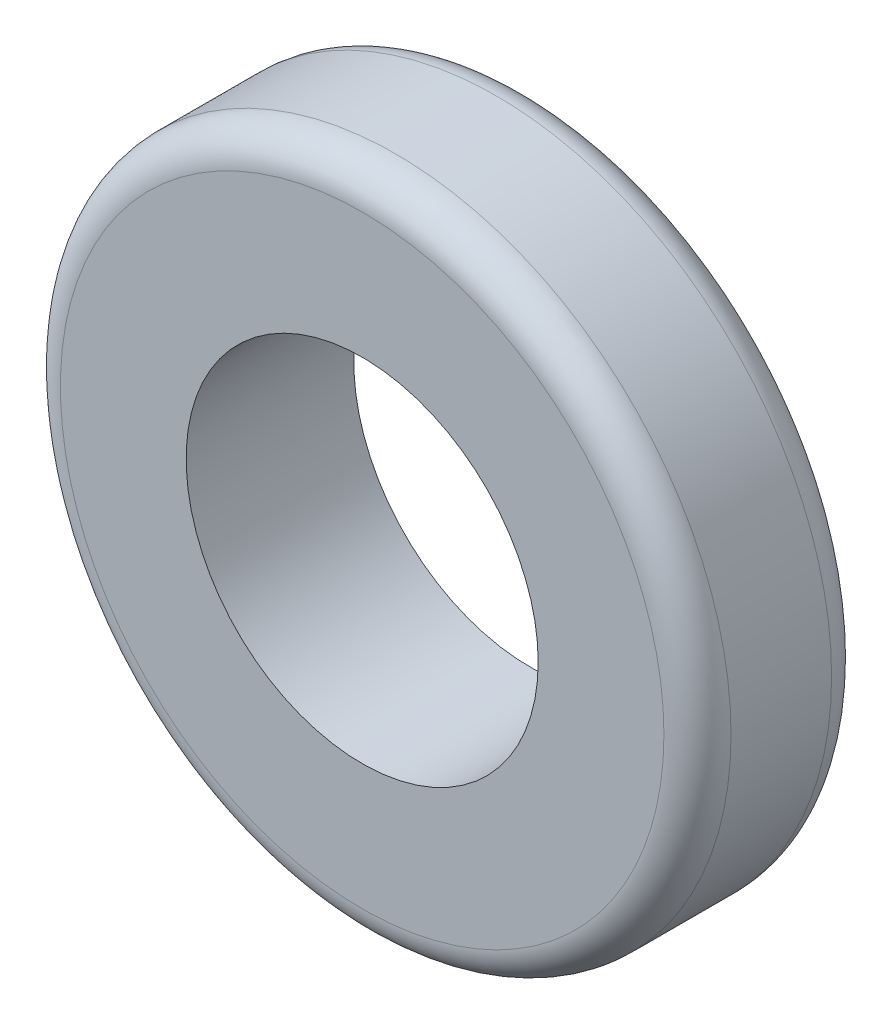
ISO-10303-21;
HEADER;
FILE_DESCRIPTION(('STEP AP214'),'2;1');
FILE_NAME('part.step','',(''),(''),'','','');
FILE_SCHEMA(('AUTOMOTIVE_DESIGN { 1 0 10303 214 1 1 1 1 }'));
ENDSEC;
DATA;
#1=APPLICATION_CONTEXT('core data for automotive mechanical design processes');
#2=APPLICATION_PROTOCOL_DEFINITION('international standard','automotive_design',2000,#1);
#3=PRODUCT_CONTEXT('',#1,'mechanical');
#4=PRODUCT('Part','Part','',(#3));
#5=PRODUCT_RELATED_PRODUCT_CATEGORY('part','',(#4));
#6=PRODUCT_DEFINITION_FORMATION('','',#4);
#7=PRODUCT_DEFINITION_CONTEXT('part definition',#1,'design');
#8=PRODUCT_DEFINITION('design','',#6,#7);
#9=PRODUCT_DEFINITION_SHAPE('','',#8);
#10=(LENGTH_UNIT() NAMED_UNIT(*) SI_UNIT(.MILLI.,.METRE.));
#11=(NAMED_UNIT(*) PLANE_ANGLE_UNIT() SI_UNIT($,.RADIAN.));
#12=(NAMED_UNIT(*) SI_UNIT($,.STERADIAN.) SOLID_ANGLE_UNIT());
#13=UNCERTAINTY_MEASURE_WITH_UNIT(LENGTH_MEASURE(1.E-05),#10,'distance_accuracy_value','');
#14=(GEOMETRIC_REPRESENTATION_CONTEXT(3) GLOBAL_UNCERTAINTY_ASSIGNED_CONTEXT((#13)) GLOBAL_UNIT_ASSIGNED_CONTEXT((#10,
#11,#12)) REPRESENTATION_CONTEXT('',''));
#15=CARTESIAN_POINT('',(0.,0.,0.));
#16=DIRECTION('',(0.,0.,1.));
#17=DIRECTION('',(1.,0.,0.));
#18=AXIS2_PLACEMENT_3D('',#15,#16,#17);
#19=CARTESIAN_POINT('',(0.,0.,6.35));
#20=DIRECTION('',(0.,0.,1.));
#21=DIRECTION('',(1.,0.,0.));
#22=AXIS2_PLACEMENT_3D('',#19,#20,#21);
#23=PLANE('',#22);
#24=CARTESIAN_POINT('',(0.,0.,6.35));
#25=DIRECTION('',(0.,0.,1.));
#26=DIRECTION('',(1.,0.,0.));
#27=AXIS2_PLACEMENT_3D('',#24,#25,#26);
#28=CIRCLE('',#27,22.86);
#29=CARTESIAN_POINT('',(22.86,0.,6.35));
#30=VERTEX_POINT('',#29);
#31=EDGE_CURVE('E10',#30,#30,#28,.T.);
#32=ORIENTED_EDGE('',*,*,#31,.T.);
#33=EDGE_LOOP('',(#32));
#34=FACE_BOUND('',#33,.T.);
#35=CARTESIAN_POINT('',(0.,0.,6.35));
#36=DIRECTION('',(0.,0.,1.));
#37=DIRECTION('',(1.,0.,0.));
#38=AXIS2_PLACEMENT_3D('',#35,#36,#37);
#39=CIRCLE('',#38,13.335);
#40=CARTESIAN_POINT('',(13.335,0.,6.35));
#41=VERTEX_POINT('',#40);
#42=EDGE_CURVE('E54',#41,#41,#39,.T.);
#43=ORIENTED_EDGE('',*,*,#42,.F.);
#44=EDGE_LOOP('',(#43));
#45=FACE_BOUND('',#44,.T.);
#46=ADVANCED_FACE('F34',(#34,#45),#23,.T.);
#47=CARTESIAN_POINT('',(0.,0.,-6.35));
#48=DIRECTION('',(0.,0.,1.));
#49=DIRECTION('',(1.,0.,0.));
#50=AXIS2_PLACEMENT_3D('',#47,#48,#49);
#51=PLANE('',#50);
#52=CARTESIAN_POINT('',(0.,0.,-6.35));
#53=DIRECTION('',(0.,0.,1.));
#54=DIRECTION('',(1.,0.,0.));
#55=AXIS2_PLACEMENT_3D('',#52,#53,#54);
#56=CIRCLE('',#55,22.86);
#57=CARTESIAN_POINT('',(22.86,0.,-6.35));
#58=VERTEX_POINT('',#57);
#59=EDGE_CURVE('E41',#58,#58,#56,.F.);
#60=ORIENTED_EDGE('',*,*,#59,.T.);
#61=EDGE_LOOP('',(#60));
#62=FACE_BOUND('',#61,.T.);
#63=CARTESIAN_POINT('',(0.,0.,-6.35));
#64=DIRECTION('',(0.,0.,1.));
#65=DIRECTION('',(1.,0.,0.));
#66=AXIS2_PLACEMENT_3D('',#63,#64,#65);
#67=CIRCLE('',#66,13.335);
#68=CARTESIAN_POINT('',(13.335,0.,-6.35));
#69=VERTEX_POINT('',#68);
#70=EDGE_CURVE('E55',#69,#69,#67,.T.);
#71=ORIENTED_EDGE('',*,*,#70,.T.);
#72=EDGE_LOOP('',(#71));
#73=FACE_BOUND('',#72,.T.);
#74=ADVANCED_FACE('F65',(#62,#73),#51,.F.);
#75=CARTESIAN_POINT('',(0.,0.,6.35));
#76=DIRECTION('',(0.,0.,-1.));
#77=DIRECTION('',(-1.,0.,0.));
#78=AXIS2_PLACEMENT_3D('',#75,#76,#77);
#79=CYLINDRICAL_SURFACE('',#78,25.4);
#80=CARTESIAN_POINT('',(0.,0.,-3.81));
#81=DIRECTION('',(0.,0.,1.));
#82=DIRECTION('',(1.,0.,0.));
#83=AXIS2_PLACEMENT_3D('',#80,#81,#82);
#84=CIRCLE('',#83,25.4);
#85=CARTESIAN_POINT('',(25.4,0.,-3.81));
#86=VERTEX_POINT('',#85);
#87=EDGE_CURVE('E45',#86,#86,#84,.T.);
#88=ORIENTED_EDGE('',*,*,#87,.T.);
#89=EDGE_LOOP('',(#88));
#90=FACE_BOUND('',#89,.T.);
#91=CARTESIAN_POINT('',(0.,0.,3.81));
#92=DIRECTION('',(0.,0.,1.));
#93=DIRECTION('',(1.,0.,0.));
#94=AXIS2_PLACEMENT_3D('',#91,#92,#93);
#95=CIRCLE('',#94,25.4);
#96=CARTESIAN_POINT('',(25.4,0.,3.81));
#97=VERTEX_POINT('',#96);
#98=EDGE_CURVE('E49',#97,#97,#95,.F.);
#99=ORIENTED_EDGE('',*,*,#98,.T.);
#100=EDGE_LOOP('',(#99));
#101=FACE_BOUND('',#100,.T.);
#102=ADVANCED_FACE('F70',(#90,#101),#79,.T.);
#103=CARTESIAN_POINT('',(0.,0.,6.35));
#104=DIRECTION('',(0.,0.,-1.));
#105=DIRECTION('',(-1.,0.,0.));
#106=AXIS2_PLACEMENT_3D('',#103,#104,#105);
#107=CYLINDRICAL_SURFACE('',#106,13.335);
#108=ORIENTED_EDGE('',*,*,#42,.T.);
#109=EDGE_LOOP('',(#108));
#110=FACE_BOUND('',#109,.T.);
#111=ORIENTED_EDGE('',*,*,#70,.F.);
#112=EDGE_LOOP('',(#111));
#113=FACE_BOUND('',#112,.T.);
#114=ADVANCED_FACE('F61',(#110,#113),#107,.F.);
#115=CARTESIAN_POINT('',(0.,0.,-3.81));
#116=DIRECTION('',(0.,0.,1.));
#117=DIRECTION('',(1.,0.,0.));
#118=AXIS2_PLACEMENT_3D('',#115,#116,#117);
#119=TOROIDAL_SURFACE('',#118,22.86,2.54);
#120=ORIENTED_EDGE('',*,*,#59,.F.);
#121=EDGE_LOOP('',(#120));
#122=FACE_BOUND('',#121,.T.);
#123=ORIENTED_EDGE('',*,*,#87,.F.);
#124=EDGE_LOOP('',(#123));
#125=FACE_BOUND('',#124,.T.);
#126=ADVANCED_FACE('F76',(#122,#125),#119,.T.);
#127=CARTESIAN_POINT('',(0.,0.,3.81));
#128=DIRECTION('',(0.,0.,1.));
#129=DIRECTION('',(1.,0.,0.));
#130=AXIS2_PLACEMENT_3D('',#127,#128,#129);
#131=TOROIDAL_SURFACE('',#130,22.86,2.54);
#132=ORIENTED_EDGE('',*,*,#98,.F.);
#133=EDGE_LOOP('',(#132));
#134=FACE_BOUND('',#133,.T.);
#135=ORIENTED_EDGE('',*,*,#31,.F.);
#136=EDGE_LOOP('',(#135));
#137=FACE_BOUND('',#136,.T.);
#138=ADVANCED_FACE('F36',(#134,#137),#131,.T.);
#139=CLOSED_SHELL('',(#46,#74,#102,#114,#126,#138));
#140=MANIFOLD_SOLID_BREP('B2',#139);
#141=ADVANCED_BREP_SHAPE_REPRESENTATION('',(#18,#140),#14);
#142=SHAPE_DEFINITION_REPRESENTATION(#9,#141);
ENDSEC;
END-ISO-10303-21;
